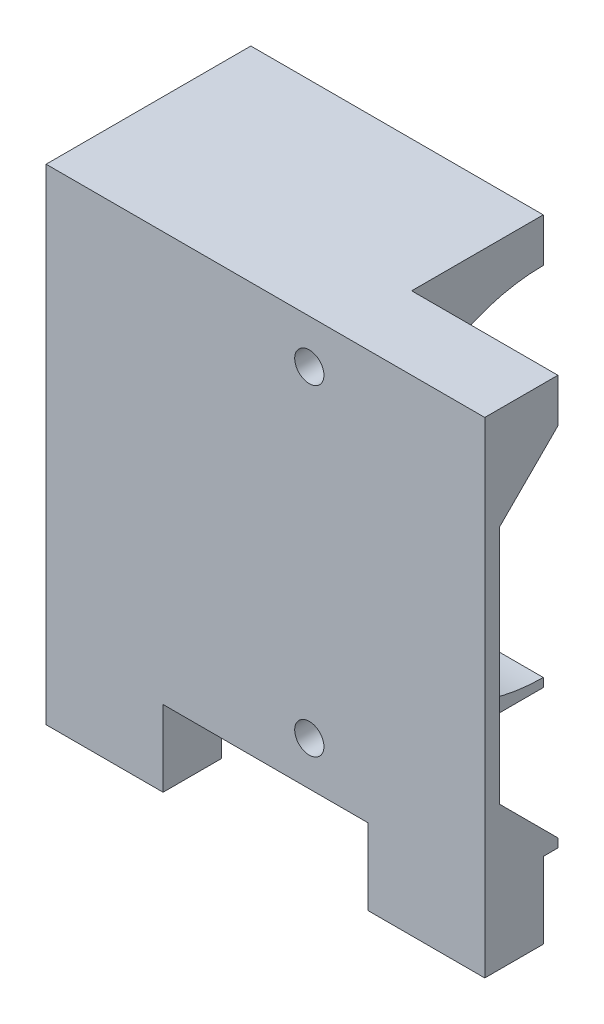
ISO-10303-21;
HEADER;
FILE_DESCRIPTION(('STEP AP214'),'2;1');
FILE_NAME('part.step','',(''),(''),'','','');
FILE_SCHEMA(('AUTOMOTIVE_DESIGN { 1 0 10303 214 1 1 1 1 }'));
ENDSEC;
DATA;
#1=APPLICATION_CONTEXT('core data for automotive mechanical design processes');
#2=APPLICATION_PROTOCOL_DEFINITION('international standard','automotive_design',2000,#1);
#3=PRODUCT_CONTEXT('',#1,'mechanical');
#4=PRODUCT('Part','Part','',(#3));
#5=PRODUCT_RELATED_PRODUCT_CATEGORY('part','',(#4));
#6=PRODUCT_DEFINITION_FORMATION('','',#4);
#7=PRODUCT_DEFINITION_CONTEXT('part definition',#1,'design');
#8=PRODUCT_DEFINITION('design','',#6,#7);
#9=PRODUCT_DEFINITION_SHAPE('','',#8);
#10=(LENGTH_UNIT() NAMED_UNIT(*) SI_UNIT(.MILLI.,.METRE.));
#11=(NAMED_UNIT(*) PLANE_ANGLE_UNIT() SI_UNIT($,.RADIAN.));
#12=(NAMED_UNIT(*) SI_UNIT($,.STERADIAN.) SOLID_ANGLE_UNIT());
#13=UNCERTAINTY_MEASURE_WITH_UNIT(LENGTH_MEASURE(1.E-05),#10,'distance_accuracy_value','');
#14=(GEOMETRIC_REPRESENTATION_CONTEXT(3) GLOBAL_UNCERTAINTY_ASSIGNED_CONTEXT((#13)) GLOBAL_UNIT_ASSIGNED_CONTEXT((#10,
#11,#12)) REPRESENTATION_CONTEXT('',''));
#15=CARTESIAN_POINT('',(0.,0.,0.));
#16=DIRECTION('',(0.,0.,1.));
#17=DIRECTION('',(1.,0.,0.));
#18=AXIS2_PLACEMENT_3D('',#15,#16,#17);
#19=CARTESIAN_POINT('',(0.,-12.8,0.));
#20=DIRECTION('',(0.,-1.,0.));
#21=DIRECTION('',(0.,0.,-1.));
#22=AXIS2_PLACEMENT_3D('',#19,#20,#21);
#23=PLANE('',#22);
#24=DIRECTION('',(0.,0.,-1.));
#25=VECTOR('',#24,1.);
#26=CARTESIAN_POINT('',(20.,-12.8,0.));
#27=LINE('',#26,#25);
#28=CARTESIAN_POINT('',(20.,-12.8,9.00000000000004));
#29=VERTEX_POINT('',#28);
#30=CARTESIAN_POINT('',(20.,-12.8,0.));
#31=VERTEX_POINT('',#30);
#32=EDGE_CURVE('E494',#29,#31,#27,.T.);
#33=ORIENTED_EDGE('',*,*,#32,.F.);
#34=DIRECTION('',(-1.,0.,0.));
#35=VECTOR('',#34,1.);
#36=CARTESIAN_POINT('',(0.,-12.8,9.00000000000004));
#37=LINE('',#36,#35);
#38=CARTESIAN_POINT('',(30.,-12.8,9.00000000000004));
#39=VERTEX_POINT('',#38);
#40=EDGE_CURVE('E498',#39,#29,#37,.T.);
#41=ORIENTED_EDGE('',*,*,#40,.F.);
#42=DIRECTION('',(0.,0.,1.));
#43=VECTOR('',#42,1.);
#44=CARTESIAN_POINT('',(30.,-12.8,13.));
#45=LINE('',#44,#43);
#46=CARTESIAN_POINT('',(30.,-12.8,10.));
#47=VERTEX_POINT('',#46);
#48=EDGE_CURVE('E196',#39,#47,#45,.T.);
#49=ORIENTED_EDGE('',*,*,#48,.T.);
#50=DIRECTION('',(1.,0.,0.));
#51=VECTOR('',#50,1.);
#52=CARTESIAN_POINT('',(22.,-12.8,10.));
#53=LINE('',#52,#51);
#54=CARTESIAN_POINT('',(22.,-12.8,10.));
#55=VERTEX_POINT('',#54);
#56=EDGE_CURVE('E286',#55,#47,#53,.T.);
#57=ORIENTED_EDGE('',*,*,#56,.F.);
#58=DIRECTION('',(0.,0.,-1.));
#59=VECTOR('',#58,1.);
#60=CARTESIAN_POINT('',(22.,-12.8,14.));
#61=LINE('',#60,#59);
#62=CARTESIAN_POINT('',(22.,-12.8,14.));
#63=VERTEX_POINT('',#62);
#64=EDGE_CURVE('E292',#63,#55,#61,.T.);
#65=ORIENTED_EDGE('',*,*,#64,.F.);
#66=DIRECTION('',(-1.,0.,0.));
#67=VECTOR('',#66,1.);
#68=CARTESIAN_POINT('',(30.,-12.8,14.));
#69=LINE('',#68,#67);
#70=CARTESIAN_POINT('',(8.,-12.8,14.));
#71=VERTEX_POINT('',#70);
#72=EDGE_CURVE('E204',#63,#71,#69,.T.);
#73=ORIENTED_EDGE('',*,*,#72,.T.);
#74=DIRECTION('',(0.,0.,1.));
#75=VECTOR('',#74,1.);
#76=CARTESIAN_POINT('',(8.,-12.8,14.));
#77=LINE('',#76,#75);
#78=CARTESIAN_POINT('',(8.,-12.8,10.));
#79=VERTEX_POINT('',#78);
#80=EDGE_CURVE('E322',#79,#71,#77,.T.);
#81=ORIENTED_EDGE('',*,*,#80,.F.);
#82=DIRECTION('',(1.,0.,0.));
#83=VECTOR('',#82,1.);
#84=CARTESIAN_POINT('',(0.,-12.8,10.));
#85=LINE('',#84,#83);
#86=CARTESIAN_POINT('',(0.,-12.8,10.));
#87=VERTEX_POINT('',#86);
#88=EDGE_CURVE('E316',#87,#79,#85,.T.);
#89=ORIENTED_EDGE('',*,*,#88,.F.);
#90=DIRECTION('',(0.,0.,-1.));
#91=VECTOR('',#90,1.);
#92=CARTESIAN_POINT('',(0.,-12.8,14.));
#93=LINE('',#92,#91);
#94=CARTESIAN_POINT('',(0.,-12.8,0.));
#95=VERTEX_POINT('',#94);
#96=EDGE_CURVE('E208',#87,#95,#93,.T.);
#97=ORIENTED_EDGE('',*,*,#96,.T.);
#98=DIRECTION('',(1.,0.,0.));
#99=VECTOR('',#98,1.);
#100=CARTESIAN_POINT('',(0.,-12.8,0.));
#101=LINE('',#100,#99);
#102=EDGE_CURVE('E216',#95,#31,#101,.T.);
#103=ORIENTED_EDGE('',*,*,#102,.T.);
#104=EDGE_LOOP('',(#33,#41,#49,#57,#65,#73,#81,#89,#97,#103));
#105=FACE_BOUND('',#104,.T.);
#106=ADVANCED_FACE('F41',(#105),#23,.T.);
#107=CARTESIAN_POINT('',(20.,0.,0.));
#108=DIRECTION('',(1.,0.,0.));
#109=DIRECTION('',(0.,0.,-1.));
#110=AXIS2_PLACEMENT_3D('',#107,#108,#109);
#111=PLANE('',#110);
#112=CARTESIAN_POINT('',(20.,0.,0.));
#113=DIRECTION('',(-1.,0.,0.));
#114=DIRECTION('',(0.,0.,-1.));
#115=AXIS2_PLACEMENT_3D('',#112,#113,#114);
#116=CIRCLE('',#115,12.2);
#117=CARTESIAN_POINT('',(20.,-12.2,0.));
#118=VERTEX_POINT('',#117);
#119=CARTESIAN_POINT('',(20.,12.2,0.));
#120=VERTEX_POINT('',#119);
#121=EDGE_CURVE('E236',#118,#120,#116,.T.);
#122=ORIENTED_EDGE('',*,*,#121,.T.);
#123=DIRECTION('',(0.,-1.,0.));
#124=VECTOR('',#123,1.);
#125=CARTESIAN_POINT('',(20.,15.2,0.));
#126=LINE('',#125,#124);
#127=CARTESIAN_POINT('',(20.,15.2,0.));
#128=VERTEX_POINT('',#127);
#129=EDGE_CURVE('E267',#128,#120,#126,.T.);
#130=ORIENTED_EDGE('',*,*,#129,.F.);
#131=DIRECTION('',(0.,0.,-1.));
#132=VECTOR('',#131,1.);
#133=CARTESIAN_POINT('',(20.,15.2,8.99999999999999));
#134=LINE('',#133,#132);
#135=CARTESIAN_POINT('',(20.,15.2,8.99999999999999));
#136=VERTEX_POINT('',#135);
#137=EDGE_CURVE('E275',#136,#128,#134,.T.);
#138=ORIENTED_EDGE('',*,*,#137,.F.);
#139=DIRECTION('',(0.,-1.,0.));
#140=VECTOR('',#139,1.);
#141=CARTESIAN_POINT('',(20.,15.2,8.99999999999999));
#142=LINE('',#141,#140);
#143=CARTESIAN_POINT('',(20.,12.2,8.99999999999999));
#144=VERTEX_POINT('',#143);
#145=EDGE_CURVE('E273',#136,#144,#142,.T.);
#146=ORIENTED_EDGE('',*,*,#145,.T.);
#147=DIRECTION('',(0.,0.707106781186546,-0.707106781186549));
#148=VECTOR('',#147,1.);
#149=CARTESIAN_POINT('',(20.,8.2,13.));
#150=LINE('',#149,#148);
#151=CARTESIAN_POINT('',(20.,8.2,13.));
#152=VERTEX_POINT('',#151);
#153=EDGE_CURVE('E351',#152,#144,#150,.T.);
#154=ORIENTED_EDGE('',*,*,#153,.F.);
#155=DIRECTION('',(0.,1.,0.));
#156=VECTOR('',#155,1.);
#157=CARTESIAN_POINT('',(20.,12.2,13.));
#158=LINE('',#157,#156);
#159=CARTESIAN_POINT('',(20.,-8.2,13.));
#160=VERTEX_POINT('',#159);
#161=EDGE_CURVE('E225',#160,#152,#158,.T.);
#162=ORIENTED_EDGE('',*,*,#161,.F.);
#163=DIRECTION('',(0.,0.707106781186551,0.707106781186544));
#164=VECTOR('',#163,1.);
#165=CARTESIAN_POINT('',(20.,-8.2,13.));
#166=LINE('',#165,#164);
#167=CARTESIAN_POINT('',(20.,-12.2,9.00000000000004));
#168=VERTEX_POINT('',#167);
#169=EDGE_CURVE('E185',#168,#160,#166,.T.);
#170=ORIENTED_EDGE('',*,*,#169,.F.);
#171=DIRECTION('',(0.,1.,0.));
#172=VECTOR('',#171,1.);
#173=CARTESIAN_POINT('',(20.,-15.2,9.00000000000004));
#174=LINE('',#173,#172);
#175=EDGE_CURVE('E180',#29,#168,#174,.T.);
#176=ORIENTED_EDGE('',*,*,#175,.F.);
#177=ORIENTED_EDGE('',*,*,#32,.T.);
#178=DIRECTION('',(0.,1.,0.));
#179=VECTOR('',#178,1.);
#180=CARTESIAN_POINT('',(20.,-15.2,0.));
#181=LINE('',#180,#179);
#182=EDGE_CURVE('E198',#31,#118,#181,.T.);
#183=ORIENTED_EDGE('',*,*,#182,.T.);
#184=EDGE_LOOP('',(#122,#130,#138,#146,#154,#162,#170,#176,#177,#183));
#185=FACE_BOUND('',#184,.T.);
#186=ADVANCED_FACE('F370',(#185),#111,.T.);
#187=CARTESIAN_POINT('',(30.,12.2,13.));
#188=DIRECTION('',(0.,0.,1.));
#189=DIRECTION('',(0.,-1.,0.));
#190=AXIS2_PLACEMENT_3D('',#187,#188,#189);
#191=PLANE('',#190);
#192=DIRECTION('',(-1.,0.,0.));
#193=VECTOR('',#192,1.);
#194=CARTESIAN_POINT('',(43.7898513407506,8.2,13.));
#195=LINE('',#194,#193);
#196=CARTESIAN_POINT('',(30.,8.2,13.));
#197=VERTEX_POINT('',#196);
#198=EDGE_CURVE('E350',#197,#152,#195,.T.);
#199=ORIENTED_EDGE('',*,*,#198,.F.);
#200=DIRECTION('',(0.,1.,0.));
#201=VECTOR('',#200,1.);
#202=CARTESIAN_POINT('',(30.,12.2,13.));
#203=LINE('',#202,#201);
#204=CARTESIAN_POINT('',(30.,-8.2,13.));
#205=VERTEX_POINT('',#204);
#206=EDGE_CURVE('E229',#205,#197,#203,.T.);
#207=ORIENTED_EDGE('',*,*,#206,.F.);
#208=DIRECTION('',(-1.,0.,0.));
#209=VECTOR('',#208,1.);
#210=CARTESIAN_POINT('',(43.7898513407506,-8.2,13.));
#211=LINE('',#210,#209);
#212=EDGE_CURVE('E202',#205,#160,#211,.T.);
#213=ORIENTED_EDGE('',*,*,#212,.T.);
#214=ORIENTED_EDGE('',*,*,#161,.T.);
#215=EDGE_LOOP('',(#199,#207,#213,#214));
#216=FACE_BOUND('',#215,.T.);
#217=ADVANCED_FACE('F454',(#216),#191,.F.);
#218=CARTESIAN_POINT('',(20.,0.,0.));
#219=DIRECTION('',(-1.,0.,0.));
#220=DIRECTION('',(0.,0.,1.));
#221=AXIS2_PLACEMENT_3D('',#218,#219,#220);
#222=CYLINDRICAL_SURFACE('',#221,12.2);
#223=CARTESIAN_POINT('',(19.,-9.8,7.26636084983398));
#224=CARTESIAN_POINT('',(18.9999951019403,-9.75839639912615,7.322473771272));
#225=CARTESIAN_POINT('',(18.9974091873031,-9.71632508140205,7.37820370502906));
#226=CARTESIAN_POINT('',(18.9866248535736,-9.63146681741656,7.48863686820499));
#227=CARTESIAN_POINT('',(18.978424516875,-9.58867963152296,7.54333974027009));
#228=CARTESIAN_POINT('',(18.9558876449707,-9.50295388367639,7.65105165130367));
#229=CARTESIAN_POINT('',(18.9415722271065,-9.46001634244181,7.70406585094563));
#230=CARTESIAN_POINT('',(18.9061155136149,-9.37444462188545,7.80796432568367));
#231=CARTESIAN_POINT('',(18.8849815169611,-9.33181016777696,7.85885081289553));
#232=CARTESIAN_POINT('',(18.835477023412,-9.24837459549311,7.95686085357734));
#233=CARTESIAN_POINT('',(18.8072409119355,-9.20755439734766,8.00403498962398));
#234=CARTESIAN_POINT('',(18.7424623227532,-9.12815928575637,8.0944619511984));
#235=CARTESIAN_POINT('',(18.7059271989872,-9.08958242222658,8.13771820126946));
#236=CARTESIAN_POINT('',(18.6311127350271,-9.02299644257417,8.21142791870496));
#237=CARTESIAN_POINT('',(18.5943202779621,-8.99433262841308,8.24278637556552));
#238=CARTESIAN_POINT('',(18.514369097831,-8.9410929838898,8.30050556158183));
#239=CARTESIAN_POINT('',(18.4712197791857,-8.91651122684542,8.32687354425474));
#240=CARTESIAN_POINT('',(18.3890831901773,-8.87794029242221,8.36796220187855));
#241=CARTESIAN_POINT('',(18.3512796299063,-8.86281068229324,8.38396909329451));
#242=CARTESIAN_POINT('',(18.2725481648678,-8.83696857060242,8.41120326062106));
#243=CARTESIAN_POINT('',(18.231622298562,-8.8262532158614,8.42243362402061));
#244=CARTESIAN_POINT('',(18.1473568023745,-8.80998129660635,8.43945334850474));
#245=CARTESIAN_POINT('',(18.1040035587846,-8.80445774521948,8.44520789331585));
#246=CARTESIAN_POINT('',(18.0165698370098,-8.79918004857003,8.45070689457084));
#247=CARTESIAN_POINT('',(17.972489639076,-8.79942372961931,8.45045361538253));
#248=CARTESIAN_POINT('',(17.889623537487,-8.80533044342407,8.44429798208322));
#249=CARTESIAN_POINT('',(17.850752530175,-8.81044369955205,8.43896870185735));
#250=CARTESIAN_POINT('',(17.7747343858212,-8.82493421207749,8.42381416212689));
#251=CARTESIAN_POINT('',(17.7375874271231,-8.83431190853011,8.41398843862568));
#252=CARTESIAN_POINT('',(17.6644320328574,-8.85717522703758,8.38991834195471));
#253=CARTESIAN_POINT('',(17.6285185180254,-8.87080169868652,8.37552209790913));
#254=CARTESIAN_POINT('',(17.5598539576093,-8.90128671577651,8.34311640498895));
#255=CARTESIAN_POINT('',(17.5271045667051,-8.91814693869897,8.32510508059532));
#256=CARTESIAN_POINT('',(17.4483929463389,-8.9640748993302,8.27568806153631));
#257=CARTESIAN_POINT('',(17.4046955087455,-8.99485851016865,8.24226092153628));
#258=CARTESIAN_POINT('',(17.3250973504188,-9.06028749269575,8.17028619653206));
#259=CARTESIAN_POINT('',(17.2892160811212,-9.09494218130143,8.13172621314567));
#260=CARTESIAN_POINT('',(17.2098551604049,-9.18304894360215,8.03229654497991));
#261=CARTESIAN_POINT('',(17.1704797736588,-9.23781125417601,7.96932734081708));
#262=CARTESIAN_POINT('',(17.1050473218695,-9.34917678779152,7.83838836032833));
#263=CARTESIAN_POINT('',(17.0790121387382,-9.40578287448098,7.77041057597106));
#264=CARTESIAN_POINT('',(17.0435107369384,-9.50478821300961,7.64875939799422));
#265=CARTESIAN_POINT('',(17.0315244778411,-9.5471811303799,7.59578665189993));
#266=CARTESIAN_POINT('',(17.0133458239082,-9.63154952288017,7.48851944888924));
#267=CARTESIAN_POINT('',(17.0071563450387,-9.67352477742028,7.43422434085644));
#268=CARTESIAN_POINT('',(16.9965020262136,-9.79844814349622,7.26975277269183));
#269=CARTESIAN_POINT('',(16.9999867427483,-9.88028572009521,7.15812270862606));
#270=CARTESIAN_POINT('',(17.0194962000273,-10.0008779948107,6.98767449340814));
#271=CARTESIAN_POINT('',(17.0287031116996,-10.0414666094349,6.92921161784075));
#272=CARTESIAN_POINT('',(17.0520661141829,-10.1211640289023,6.81227031665492));
#273=CARTESIAN_POINT('',(17.0662202322588,-10.1602734167195,6.75379190650498));
#274=CARTESIAN_POINT('',(17.0994430196776,-10.236726398515,6.63733943297201));
#275=CARTESIAN_POINT('',(17.1184972082006,-10.2740748181167,6.57936439519263));
#276=CARTESIAN_POINT('',(17.1617433034792,-10.346918474786,6.46420243377413));
#277=CARTESIAN_POINT('',(17.1859322889166,-10.3824147513403,6.40701508161776));
#278=CARTESIAN_POINT('',(17.238352637079,-10.4493028477658,6.2972974384712));
#279=CARTESIAN_POINT('',(17.2662678664056,-10.4808133159989,6.24468950396364));
#280=CARTESIAN_POINT('',(17.3278580372318,-10.5416908281703,6.14136392281031));
#281=CARTESIAN_POINT('',(17.3615468637097,-10.5710524555834,6.09065120071016));
#282=CARTESIAN_POINT('',(17.4361983450749,-10.627254162087,5.9920553251412));
#283=CARTESIAN_POINT('',(17.4772471456419,-10.6540578874406,5.94421577562127));
#284=CARTESIAN_POINT('',(17.5680201653627,-10.7033508903423,5.85498296106352));
#285=CARTESIAN_POINT('',(17.6176918525665,-10.7258646543301,5.81355338085668));
#286=CARTESIAN_POINT('',(17.6973949505115,-10.7534752467967,5.76221448899234));
#287=CARTESIAN_POINT('',(17.7233087667438,-10.7613631071318,5.74745914075393));
#288=CARTESIAN_POINT('',(17.7772804644183,-10.7752806092437,5.72132359490914));
#289=CARTESIAN_POINT('',(17.8053370499211,-10.7813113632576,5.70994137725987));
#290=CARTESIAN_POINT('',(17.8636102609801,-10.7910993871494,5.69142233521061));
#291=CARTESIAN_POINT('',(17.8938481261187,-10.7948295395822,5.68433616476535));
#292=CARTESIAN_POINT('',(17.9553007792492,-10.7994733355157,5.67550905125707));
#293=CARTESIAN_POINT('',(17.9865142154852,-10.8003907156164,5.67376101681187));
#294=CARTESIAN_POINT('',(18.0450217224969,-10.7993638111779,5.67571495985376));
#295=CARTESIAN_POINT('',(18.072344914943,-10.7977434650693,5.67880001217109));
#296=CARTESIAN_POINT('',(18.1260245457789,-10.7923946104673,5.68895868897423));
#297=CARTESIAN_POINT('',(18.1523801495044,-10.7886643253757,5.69603567471014));
#298=CARTESIAN_POINT('',(18.2120083553291,-10.7778794286953,5.71642241415072));
#299=CARTESIAN_POINT('',(18.2447117799562,-10.7701355449256,5.73101552975052));
#300=CARTESIAN_POINT('',(18.30709035435,-10.75223653844,5.7645270809336));
#301=CARTESIAN_POINT('',(18.3367583645939,-10.7420759097266,5.7834553895506));
#302=CARTESIAN_POINT('',(18.411755341776,-10.7126832923737,5.83779786678237));
#303=CARTESIAN_POINT('',(18.4545262294816,-10.6918848130714,5.8758580345482));
#304=CARTESIAN_POINT('',(18.5334023307482,-10.6470795825837,5.9566648855123));
#305=CARTESIAN_POINT('',(18.569487679907,-10.6230636245339,5.99942495202629));
#306=CARTESIAN_POINT('',(18.6345085574204,-10.5739328525204,6.08558006234385));
#307=CARTESIAN_POINT('',(18.6637067655203,-10.5489285743825,6.12884268098506));
#308=CARTESIAN_POINT('',(18.7178447414388,-10.4972095380298,6.21700968186416));
#309=CARTESIAN_POINT('',(18.7427808215311,-10.4704933257966,6.26191544543043));
#310=CARTESIAN_POINT('',(18.7888765660626,-10.4155959580269,6.35280906332651));
#311=CARTESIAN_POINT('',(18.8100328135093,-10.3874135064156,6.39879785464559));
#312=CARTESIAN_POINT('',(18.8488537445388,-10.3297683893212,6.49144552167124));
#313=CARTESIAN_POINT('',(18.8665176520294,-10.3003054410477,6.5381045438556));
#314=CARTESIAN_POINT('',(18.9018428876558,-10.2340128481421,6.64149721463276));
#315=CARTESIAN_POINT('',(18.91874988185,-10.1969187239288,6.69832090630451));
#316=CARTESIAN_POINT('',(18.9478690255452,-10.1212273991921,6.81215421957728));
#317=CARTESIAN_POINT('',(18.9600801372408,-10.0826298684843,6.86916387947362));
#318=CARTESIAN_POINT('',(18.9896732920444,-9.96471877155049,7.04013212251928));
#319=CARTESIAN_POINT('',(19.0000098066722,-9.88329683593586,7.15401411270715));
#320=CARTESIAN_POINT('',(19.,-9.8,7.26636084983398));
#321=B_SPLINE_CURVE_WITH_KNOTS('',3,(#223,#224,#225,#226,#227,#228,#229,#230,#231,#232,#233,
#234,#235,#236,#237,#238,#239,#240,#241,#242,#243,#244,#245,#246,#247,#248,#249,#250,#251,#252,
#253,#254,#255,#256,#257,#258,#259,#260,#261,#262,#263,#264,#265,#266,#267,#268,#269,#270,#271,
#272,#273,#274,#275,#276,#277,#278,#279,#280,#281,#282,#283,#284,#285,#286,#287,#288,#289,#290,
#291,#292,#293,#294,#295,#296,#297,#298,#299,#300,#301,#302,#303,#304,#305,#306,#307,#308,#309,
#310,#311,#312,#313,#314,#315,#316,#317,#318,#319,#320),.UNSPECIFIED.,.T.,.F.,(4,2,2,2,2,2,2,2,
2,2,2,2,2,2,2,2,2,2,2,2,2,2,2,2,2,2,2,2,2,2,2,2,2,2,2,2,2,2,2,2,2,2,2,2,2,2,2,2,4),(0.,
0.209451237013676,0.418974047828406,0.627779085126616,0.836361343768984,1.04126010121244,
1.24597799673009,1.41399554412923,1.58176697498808,1.71250521004581,1.84315880860972,
1.97463768323555,2.10606700384691,2.22422349365931,2.34239217901709,2.46499183499756,
2.58765526137787,2.77571803649254,2.9642436120573,3.23954318790848,3.51529290306696,
3.72171300578965,3.92823688875091,4.34180302501645,4.55696836132573,4.77204799657041,
4.98649918410129,5.20082869026583,5.40271757958828,5.60509898721111,5.81002548345986,
6.01374474639197,6.10603773407127,6.19827533868859,6.29158035896336,6.38476137527449,
6.46698100010749,6.54926995829699,6.65856960896198,6.7681207000401,6.94983976506714,
7.13209039445232,7.30546207178664,7.47898300459161,7.65266001633771,7.82637558052504,
8.0359770349589,8.24562478541473,8.66497851825604),.UNSPECIFIED.);
#322=CARTESIAN_POINT('',(19.,-9.8,7.26636084983398));
#323=VERTEX_POINT('',#322);
#324=EDGE_CURVE('E388',#323,#323,#321,.T.);
#325=ORIENTED_EDGE('',*,*,#324,.T.);
#326=EDGE_LOOP('',(#325));
#327=FACE_BOUND('',#326,.T.);
#328=DIRECTION('',(-1.,0.,0.));
#329=VECTOR('',#328,1.);
#330=CARTESIAN_POINT('',(20.,12.2,0.));
#331=LINE('',#330,#329);
#332=CARTESIAN_POINT('',(17.,12.2,0.));
#333=VERTEX_POINT('',#332);
#334=CARTESIAN_POINT('',(0.,12.2,0.));
#335=VERTEX_POINT('',#334);
#336=EDGE_CURVE('E51',#333,#335,#331,.T.);
#337=ORIENTED_EDGE('',*,*,#336,.F.);
#338=CARTESIAN_POINT('',(17.,12.2,0.));
#339=CARTESIAN_POINT('',(17.000003386518,12.1999999903481,0.0828428717524075));
#340=CARTESIAN_POINT('',(16.9999995583837,12.1991561643882,0.165683397825968));
#341=CARTESIAN_POINT('',(17.0000068487499,12.1957813761313,0.331330076990716));
#342=CARTESIAN_POINT('',(17.0000179672507,12.1932504138007,0.414136230081218));
#343=CARTESIAN_POINT('',(17.000117826203,12.1831255809122,0.66250731613896));
#344=CARTESIAN_POINT('',(17.0002731026956,12.1729997647555,0.827976086824617));
#345=CARTESIAN_POINT('',(17.0013785527574,12.1457355456454,1.16177886881091));
#346=CARTESIAN_POINT('',(17.0023451220015,12.1284562553978,1.33010124923694));
#347=CARTESIAN_POINT('',(17.0061946030503,12.0869198766639,1.66582244591738));
#348=CARTESIAN_POINT('',(17.0090769981131,12.0626646707417,1.83322149894148));
#349=CARTESIAN_POINT('',(17.0183592793546,12.0071954152815,2.16700793224814));
#350=CARTESIAN_POINT('',(17.0247639989648,11.9759718386143,2.33339360401428));
#351=CARTESIAN_POINT('',(17.0433131599214,11.906655800117,2.6646157044976));
#352=CARTESIAN_POINT('',(17.0554628165865,11.86855711646,2.82945058643586));
#353=CARTESIAN_POINT('',(17.0803246718761,11.8067113207415,3.07384673364089));
#354=CARTESIAN_POINT('',(17.0896467183309,11.7854470799205,3.15438602263612));
#355=CARTESIAN_POINT('',(17.1110314547224,11.7413742656985,3.31466934682371));
#356=CARTESIAN_POINT('',(17.1230936799359,11.7185659546255,3.39441351447426));
#357=CARTESIAN_POINT('',(17.1506076251612,11.6715366159059,3.55275150126662));
#358=CARTESIAN_POINT('',(17.1660536145727,11.6473180269548,3.6313470284911));
#359=CARTESIAN_POINT('',(17.2012267935722,11.5975946457157,3.78714573298034));
#360=CARTESIAN_POINT('',(17.2209516316716,11.5720905657699,3.86434964987894));
#361=CARTESIAN_POINT('',(17.2520676160648,11.5360951764337,3.96981942980117));
#362=CARTESIAN_POINT('',(17.2611060923312,11.5260352344678,3.99893126005435));
#363=CARTESIAN_POINT('',(17.2800935077082,11.5057902906436,4.05681283848244));
#364=CARTESIAN_POINT('',(17.2900424941673,11.4956052823055,4.08558256877944));
#365=CARTESIAN_POINT('',(17.3215254408212,11.4647835305145,4.17162510133746));
#366=CARTESIAN_POINT('',(17.344600841918,11.4439926518024,4.22830175849792));
#367=CARTESIAN_POINT('',(17.3876496961936,11.4090983913426,4.32135267295958));
#368=CARTESIAN_POINT('',(17.4062216306203,11.39500176378,4.35837709053974));
#369=CARTESIAN_POINT('',(17.446204634423,11.3669889188216,4.43092209491917));
#370=CARTESIAN_POINT('',(17.4676138562414,11.3530725904393,4.46644364065402));
#371=CARTESIAN_POINT('',(17.5136962428505,11.325802513076,4.53514644741573));
#372=CARTESIAN_POINT('',(17.5383445438854,11.3124454093234,4.56834284660515));
#373=CARTESIAN_POINT('',(17.5916994929355,11.2866724118508,4.63165029183189));
#374=CARTESIAN_POINT('',(17.6203950304969,11.2742540797882,4.66176940775884));
#375=CARTESIAN_POINT('',(17.6714099633539,11.2552899532555,4.70731585532169));
#376=CARTESIAN_POINT('',(17.6922989670164,11.2482409364627,4.72412542883967));
#377=CARTESIAN_POINT('',(17.7362324794196,11.2351412888003,4.7551954180229));
#378=CARTESIAN_POINT('',(17.7592778739749,11.2290910710692,4.76945477903284));
#379=CARTESIAN_POINT('',(17.8077741370935,11.2183321474258,4.79470701893806));
#380=CARTESIAN_POINT('',(17.8332491675034,11.2136393125249,4.80566131298682));
#381=CARTESIAN_POINT('',(17.8859638866078,11.2061691044766,4.82305565969229));
#382=CARTESIAN_POINT('',(17.9132003636146,11.2033883470329,4.829503688581));
#383=CARTESIAN_POINT('',(17.9665576071161,11.200228450023,4.83682727961025));
#384=CARTESIAN_POINT('',(17.9926173517533,11.1996906960215,4.83807089591821));
#385=CARTESIAN_POINT('',(18.0444949408281,11.2006536641591,4.83584106560611));
#386=CARTESIAN_POINT('',(18.0703127709465,11.2021545062078,4.83236734151333));
#387=CARTESIAN_POINT('',(18.1174755878181,11.2066785627858,4.82186498019404));
#388=CARTESIAN_POINT('',(18.138964178354,11.2094771953864,4.81536023940586));
#389=CARTESIAN_POINT('',(18.1807003959933,11.2162344365686,4.79959986457201));
#390=CARTESIAN_POINT('',(18.2009476121923,11.2201934267574,4.79034332552708));
#391=CARTESIAN_POINT('',(18.2523686530597,11.2318165780578,4.76304843499015));
#392=CARTESIAN_POINT('',(18.2823804026556,11.240242817678,4.74315338430474));
#393=CARTESIAN_POINT('',(18.3387345112438,11.2586479553968,4.69929936880997));
#394=CARTESIAN_POINT('',(18.3650657663972,11.2686313675253,4.67532857016512));
#395=CARTESIAN_POINT('',(18.4117960947338,11.2884106025605,4.62735200430135));
#396=CARTESIAN_POINT('',(18.4325285322754,11.2981116076363,4.60362598318759));
#397=CARTESIAN_POINT('',(18.4717348517167,11.3179860036373,4.55454680635841));
#398=CARTESIAN_POINT('',(18.490206819551,11.3281597849689,4.52919229903401));
#399=CARTESIAN_POINT('',(18.5427417843051,11.3591112992593,4.45125872564929));
#400=CARTESIAN_POINT('',(18.5738691597248,11.3802942386657,4.39686978252086));
#401=CARTESIAN_POINT('',(18.6407301849273,11.4307051256678,4.2644699789416));
#402=CARTESIAN_POINT('',(18.6738574810291,11.4599892940783,4.18520955502616));
#403=CARTESIAN_POINT('',(18.7322796963708,11.5177666395483,4.02348902524985));
#404=CARTESIAN_POINT('',(18.7575589140076,11.5462581283915,3.94102287170107));
#405=CARTESIAN_POINT('',(18.8024479028512,11.6021912971016,3.77320360421243));
#406=CARTESIAN_POINT('',(18.8219940978167,11.6296184769589,3.68782903792358));
#407=CARTESIAN_POINT('',(18.8564423806049,11.6827919874685,3.51574773541551));
#408=CARTESIAN_POINT('',(18.8713487549493,11.7085398520733,3.42904230691051));
#409=CARTESIAN_POINT('',(18.9053500257982,11.7729679045171,3.20282599880127));
#410=CARTESIAN_POINT('',(18.9216827734533,11.8102573579491,3.06250668551326));
#411=CARTESIAN_POINT('',(18.9481178584982,11.8799218250052,2.78004500959674));
#412=CARTESIAN_POINT('',(18.958216891806,11.9122942255816,2.63790172087078));
#413=CARTESIAN_POINT('',(18.9741622095864,11.9720401744988,2.35194501147096));
#414=CARTESIAN_POINT('',(18.9799970336142,11.9994001047617,2.20812813776849));
#415=CARTESIAN_POINT('',(18.9888436528075,12.0489376262116,1.91951675704195));
#416=CARTESIAN_POINT('',(18.9918552469798,12.0711148483436,1.77472218115167));
#417=CARTESIAN_POINT('',(18.9960118992643,12.1089167401278,1.49424873747466));
#418=CARTESIAN_POINT('',(18.9972696519881,12.1248836967766,1.35861733045832));
#419=CARTESIAN_POINT('',(18.998953124649,12.1522561146163,1.08688519011824));
#420=CARTESIAN_POINT('',(18.9993788123722,12.1636613991858,0.950784438827904));
#421=CARTESIAN_POINT('',(18.999878766565,12.1818492684304,0.678973468161607));
#422=CARTESIAN_POINT('',(18.9999548191347,12.1886551961519,0.543264811234845));
#423=CARTESIAN_POINT('',(18.9999988461775,12.1977308758061,0.271704113798151));
#424=CARTESIAN_POINT('',(18.9999668272158,12.2000009032746,0.135852082499197));
#425=CARTESIAN_POINT('',(19.000000000003,12.2,4.60025870261651E-13));
#426=B_SPLINE_CURVE_WITH_KNOTS('',3,(#338,#339,#340,#341,#342,#343,#344,#345,#346,#347,#348,
#349,#350,#351,#352,#353,#354,#355,#356,#357,#358,#359,#360,#361,#362,#363,#364,#365,#366,#367,
#368,#369,#370,#371,#372,#373,#374,#375,#376,#377,#378,#379,#380,#381,#382,#383,#384,#385,#386,
#387,#388,#389,#390,#391,#392,#393,#394,#395,#396,#397,#398,#399,#400,#401,#402,#403,#404,#405,
#406,#407,#408,#409,#410,#411,#412,#413,#414,#415,#416,#417,#418,#419,#420,#421,#422,#423,#424,
#425),.UNSPECIFIED.,.F.,.F.,(4,2,2,2,2,2,2,2,2,2,2,2,2,2,2,2,2,2,2,2,2,2,2,2,2,2,2,2,2,2,2,2,2,
2,2,2,2,2,2,2,2,2,2,4),(0.,0.248519627516359,0.497039259991051,0.994224782007207,
1.50170698795773,2.00905236990172,2.51709568865282,3.02560110291694,3.27701022863209,
3.52837674816511,3.77932081038557,4.03012731133876,4.12641319770917,4.22270409399597,
4.41636651928504,4.54754140983672,4.67863129906563,4.80876804192838,4.93855424674906,
5.02155513913749,5.10459027805482,5.18856030810431,5.27238132950638,5.35016248738675,
5.4279482205326,5.49556858827132,5.56321121934642,5.6735137384795,5.78414216503477,
5.88289992174005,5.98174073183541,6.17967491559305,6.45137230422356,6.72360982432508,
6.99876111642114,7.27365744889731,7.71165145308781,8.14987741020284,8.58927685059567,
9.02870757062491,9.43834872003509,9.84800572863715,10.2555676748063,10.6631048626439),.UNSPECIFIED.);
#427=CARTESIAN_POINT('',(19.,12.2,0.));
#428=VERTEX_POINT('',#427);
#429=EDGE_CURVE('E57',#333,#428,#426,.T.);
#430=ORIENTED_EDGE('',*,*,#429,.T.);
#431=EDGE_CURVE('E11',#120,#428,#331,.T.);
#432=ORIENTED_EDGE('',*,*,#431,.F.);
#433=ORIENTED_EDGE('',*,*,#121,.F.);
#434=DIRECTION('',(-1.,0.,0.));
#435=VECTOR('',#434,1.);
#436=CARTESIAN_POINT('',(20.,-12.2,0.));
#437=LINE('',#436,#435);
#438=CARTESIAN_POINT('',(0.,-12.2,0.));
#439=VERTEX_POINT('',#438);
#440=EDGE_CURVE('E239',#118,#439,#437,.T.);
#441=ORIENTED_EDGE('',*,*,#440,.T.);
#442=CARTESIAN_POINT('',(0.,0.,0.));
#443=DIRECTION('',(-1.,0.,0.));
#444=DIRECTION('',(0.,0.,-1.));
#445=AXIS2_PLACEMENT_3D('',#442,#443,#444);
#446=CIRCLE('',#445,12.2);
#447=EDGE_CURVE('E232',#439,#335,#446,.T.);
#448=ORIENTED_EDGE('',*,*,#447,.T.);
#449=EDGE_LOOP('',(#337,#430,#432,#433,#441,#448));
#450=FACE_BOUND('',#449,.T.);
#451=ADVANCED_FACE('F43',(#327,#450),#222,.F.);
#452=CARTESIAN_POINT('',(20.,12.2,14.));
#453=DIRECTION('',(0.,0.,-1.));
#454=DIRECTION('',(0.,1.,0.));
#455=AXIS2_PLACEMENT_3D('',#452,#453,#454);
#456=PLANE('',#455);
#457=CARTESIAN_POINT('',(18.,12.2,14.));
#458=DIRECTION('',(0.,0.,1.));
#459=DIRECTION('',(1.,0.,0.));
#460=AXIS2_PLACEMENT_3D('',#457,#458,#459);
#461=CIRCLE('',#460,1.);
#462=CARTESIAN_POINT('',(19.,12.2,14.));
#463=VERTEX_POINT('',#462);
#464=EDGE_CURVE('E471',#463,#463,#461,.T.);
#465=ORIENTED_EDGE('',*,*,#464,.F.);
#466=EDGE_LOOP('',(#465));
#467=FACE_BOUND('',#466,.T.);
#468=CARTESIAN_POINT('',(18.,-9.8,14.));
#469=DIRECTION('',(0.,0.,1.));
#470=DIRECTION('',(1.,0.,0.));
#471=AXIS2_PLACEMENT_3D('',#468,#469,#470);
#472=CIRCLE('',#471,1.);
#473=CARTESIAN_POINT('',(19.,-9.8,14.));
#474=VERTEX_POINT('',#473);
#475=EDGE_CURVE('E475',#474,#474,#472,.T.);
#476=ORIENTED_EDGE('',*,*,#475,.F.);
#477=EDGE_LOOP('',(#476));
#478=FACE_BOUND('',#477,.T.);
#479=DIRECTION('',(0.,-1.,0.));
#480=VECTOR('',#479,1.);
#481=CARTESIAN_POINT('',(0.,12.2,14.));
#482=LINE('',#481,#480);
#483=CARTESIAN_POINT('',(0.,15.2,14.));
#484=VERTEX_POINT('',#483);
#485=CARTESIAN_POINT('',(0.,-18.,14.));
#486=VERTEX_POINT('',#485);
#487=EDGE_CURVE('E240',#484,#486,#482,.T.);
#488=ORIENTED_EDGE('',*,*,#487,.T.);
#489=DIRECTION('',(-1.,0.,0.));
#490=VECTOR('',#489,1.);
#491=CARTESIAN_POINT('',(0.,-18.,14.));
#492=LINE('',#491,#490);
#493=CARTESIAN_POINT('',(8.,-18.,14.));
#494=VERTEX_POINT('',#493);
#495=EDGE_CURVE('E328',#494,#486,#492,.T.);
#496=ORIENTED_EDGE('',*,*,#495,.F.);
#497=DIRECTION('',(0.,1.,0.));
#498=VECTOR('',#497,1.);
#499=CARTESIAN_POINT('',(8.,-18.,14.));
#500=LINE('',#499,#498);
#501=EDGE_CURVE('E332',#494,#71,#500,.T.);
#502=ORIENTED_EDGE('',*,*,#501,.T.);
#503=ORIENTED_EDGE('',*,*,#72,.F.);
#504=DIRECTION('',(0.,1.,0.));
#505=VECTOR('',#504,1.);
#506=CARTESIAN_POINT('',(22.,-18.,14.));
#507=LINE('',#506,#505);
#508=CARTESIAN_POINT('',(22.,-18.,14.));
#509=VERTEX_POINT('',#508);
#510=EDGE_CURVE('E65',#509,#63,#507,.T.);
#511=ORIENTED_EDGE('',*,*,#510,.F.);
#512=DIRECTION('',(-1.,0.,0.));
#513=VECTOR('',#512,1.);
#514=CARTESIAN_POINT('',(22.,-18.,14.));
#515=LINE('',#514,#513);
#516=CARTESIAN_POINT('',(30.,-18.,14.));
#517=VERTEX_POINT('',#516);
#518=EDGE_CURVE('E296',#517,#509,#515,.T.);
#519=ORIENTED_EDGE('',*,*,#518,.F.);
#520=DIRECTION('',(0.,-1.,0.));
#521=VECTOR('',#520,1.);
#522=CARTESIAN_POINT('',(30.,12.2,14.));
#523=LINE('',#522,#521);
#524=CARTESIAN_POINT('',(30.,15.2,14.));
#525=VERTEX_POINT('',#524);
#526=EDGE_CURVE('E226',#525,#517,#523,.T.);
#527=ORIENTED_EDGE('',*,*,#526,.F.);
#528=DIRECTION('',(1.,0.,0.));
#529=VECTOR('',#528,1.);
#530=CARTESIAN_POINT('',(0.,15.2,14.));
#531=LINE('',#530,#529);
#532=EDGE_CURVE('E382',#484,#525,#531,.T.);
#533=ORIENTED_EDGE('',*,*,#532,.F.);
#534=EDGE_LOOP('',(#488,#496,#502,#503,#511,#519,#527,#533));
#535=FACE_BOUND('',#534,.T.);
#536=ADVANCED_FACE('F461',(#467,#478,#535),#456,.F.);
#537=CARTESIAN_POINT('',(0.,0.,0.));
#538=DIRECTION('',(1.,0.,0.));
#539=DIRECTION('',(0.,0.,-1.));
#540=AXIS2_PLACEMENT_3D('',#537,#538,#539);
#541=PLANE('',#540);
#542=ORIENTED_EDGE('',*,*,#447,.F.);
#543=DIRECTION('',(0.,1.,0.));
#544=VECTOR('',#543,1.);
#545=CARTESIAN_POINT('',(0.,-12.8,0.));
#546=LINE('',#545,#544);
#547=EDGE_CURVE('E222',#95,#439,#546,.T.);
#548=ORIENTED_EDGE('',*,*,#547,.F.);
#549=ORIENTED_EDGE('',*,*,#96,.F.);
#550=DIRECTION('',(0.,1.,0.));
#551=VECTOR('',#550,1.);
#552=CARTESIAN_POINT('',(0.,-18.,9.99999999999999));
#553=LINE('',#552,#551);
#554=CARTESIAN_POINT('',(0.,-18.,9.99999999999999));
#555=VERTEX_POINT('',#554);
#556=EDGE_CURVE('E346',#555,#87,#553,.T.);
#557=ORIENTED_EDGE('',*,*,#556,.F.);
#558=DIRECTION('',(0.,0.,-1.));
#559=VECTOR('',#558,1.);
#560=CARTESIAN_POINT('',(0.,-18.,14.));
#561=LINE('',#560,#559);
#562=EDGE_CURVE('E317',#486,#555,#561,.T.);
#563=ORIENTED_EDGE('',*,*,#562,.F.);
#564=ORIENTED_EDGE('',*,*,#487,.F.);
#565=DIRECTION('',(0.,0.,1.));
#566=VECTOR('',#565,1.);
#567=CARTESIAN_POINT('',(0.,15.2,0.));
#568=LINE('',#567,#566);
#569=CARTESIAN_POINT('',(0.,15.2,0.));
#570=VERTEX_POINT('',#569);
#571=EDGE_CURVE('E265',#570,#484,#568,.T.);
#572=ORIENTED_EDGE('',*,*,#571,.F.);
#573=DIRECTION('',(0.,-1.,0.));
#574=VECTOR('',#573,1.);
#575=CARTESIAN_POINT('',(0.,15.2,0.));
#576=LINE('',#575,#574);
#577=EDGE_CURVE('E258',#570,#335,#576,.T.);
#578=ORIENTED_EDGE('',*,*,#577,.T.);
#579=EDGE_LOOP('',(#542,#548,#549,#557,#563,#564,#572,#578));
#580=FACE_BOUND('',#579,.T.);
#581=ADVANCED_FACE('F263',(#580),#541,.F.);
#582=CARTESIAN_POINT('',(30.,0.,0.));
#583=DIRECTION('',(1.,0.,0.));
#584=DIRECTION('',(0.,0.,-1.));
#585=AXIS2_PLACEMENT_3D('',#582,#583,#584);
#586=PLANE('',#585);
#587=DIRECTION('',(0.,1.,0.));
#588=VECTOR('',#587,1.);
#589=CARTESIAN_POINT('',(30.,-15.2,9.00000000000004));
#590=LINE('',#589,#588);
#591=CARTESIAN_POINT('',(30.,-12.2,9.00000000000004));
#592=VERTEX_POINT('',#591);
#593=EDGE_CURVE('E177',#39,#592,#590,.T.);
#594=ORIENTED_EDGE('',*,*,#593,.T.);
#595=DIRECTION('',(0.,0.707106781186551,0.707106781186544));
#596=VECTOR('',#595,1.);
#597=CARTESIAN_POINT('',(30.,-8.2,13.));
#598=LINE('',#597,#596);
#599=EDGE_CURVE('E193',#592,#205,#598,.T.);
#600=ORIENTED_EDGE('',*,*,#599,.T.);
#601=ORIENTED_EDGE('',*,*,#206,.T.);
#602=DIRECTION('',(0.,0.707106781186546,-0.707106781186549));
#603=VECTOR('',#602,1.);
#604=CARTESIAN_POINT('',(30.,8.2,13.));
#605=LINE('',#604,#603);
#606=CARTESIAN_POINT('',(30.,12.2,8.99999999999999));
#607=VERTEX_POINT('',#606);
#608=EDGE_CURVE('E186',#197,#607,#605,.T.);
#609=ORIENTED_EDGE('',*,*,#608,.T.);
#610=DIRECTION('',(0.,-1.,0.));
#611=VECTOR('',#610,1.);
#612=CARTESIAN_POINT('',(30.,15.2,8.99999999999999));
#613=LINE('',#612,#611);
#614=CARTESIAN_POINT('',(30.,15.2,8.99999999999999));
#615=VERTEX_POINT('',#614);
#616=EDGE_CURVE('E282',#615,#607,#613,.T.);
#617=ORIENTED_EDGE('',*,*,#616,.F.);
#618=DIRECTION('',(0.,0.,-1.));
#619=VECTOR('',#618,1.);
#620=CARTESIAN_POINT('',(30.,15.2,8.99999999999999));
#621=LINE('',#620,#619);
#622=EDGE_CURVE('E377',#525,#615,#621,.T.);
#623=ORIENTED_EDGE('',*,*,#622,.F.);
#624=ORIENTED_EDGE('',*,*,#526,.T.);
#625=DIRECTION('',(0.,0.,1.));
#626=VECTOR('',#625,1.);
#627=CARTESIAN_POINT('',(30.,-18.,14.));
#628=LINE('',#627,#626);
#629=CARTESIAN_POINT('',(30.,-18.,9.99999999999999));
#630=VERTEX_POINT('',#629);
#631=EDGE_CURVE('E291',#630,#517,#628,.T.);
#632=ORIENTED_EDGE('',*,*,#631,.F.);
#633=DIRECTION('',(0.,1.,0.));
#634=VECTOR('',#633,1.);
#635=CARTESIAN_POINT('',(30.,-18.,9.99999999999999));
#636=LINE('',#635,#634);
#637=EDGE_CURVE('E313',#630,#47,#636,.T.);
#638=ORIENTED_EDGE('',*,*,#637,.T.);
#639=ORIENTED_EDGE('',*,*,#48,.F.);
#640=EDGE_LOOP('',(#594,#600,#601,#609,#617,#623,#624,#632,#638,#639));
#641=FACE_BOUND('',#640,.T.);
#642=ADVANCED_FACE('F191',(#641),#586,.T.);
#643=CARTESIAN_POINT('',(0.,-12.8,0.));
#644=DIRECTION('',(0.,0.,1.));
#645=DIRECTION('',(0.,-1.,0.));
#646=AXIS2_PLACEMENT_3D('',#643,#644,#645);
#647=PLANE('',#646);
#648=ORIENTED_EDGE('',*,*,#440,.F.);
#649=ORIENTED_EDGE('',*,*,#182,.F.);
#650=ORIENTED_EDGE('',*,*,#102,.F.);
#651=ORIENTED_EDGE('',*,*,#547,.T.);
#652=EDGE_LOOP('',(#648,#649,#650,#651));
#653=FACE_BOUND('',#652,.T.);
#654=ADVANCED_FACE('F445',(#653),#647,.F.);
#655=CARTESIAN_POINT('',(43.7898513407506,-8.2,13.));
#656=DIRECTION('',(0.,-0.707106781186544,0.707106781186551));
#657=DIRECTION('',(0.,-0.707106781186551,-0.707106781186544));
#658=AXIS2_PLACEMENT_3D('',#655,#656,#657);
#659=PLANE('',#658);
#660=ORIENTED_EDGE('',*,*,#599,.F.);
#661=DIRECTION('',(-1.,0.,0.));
#662=VECTOR('',#661,1.);
#663=CARTESIAN_POINT('',(43.7898513407506,-12.2,9.00000000000004));
#664=LINE('',#663,#662);
#665=EDGE_CURVE('E174',#592,#168,#664,.T.);
#666=ORIENTED_EDGE('',*,*,#665,.T.);
#667=ORIENTED_EDGE('',*,*,#169,.T.);
#668=ORIENTED_EDGE('',*,*,#212,.F.);
#669=EDGE_LOOP('',(#660,#666,#667,#668));
#670=FACE_BOUND('',#669,.T.);
#671=ADVANCED_FACE('F200',(#670),#659,.F.);
#672=CARTESIAN_POINT('',(43.7898513407506,8.2,13.));
#673=DIRECTION('',(0.,0.707106781186549,0.707106781186546));
#674=DIRECTION('',(0.,-0.707106781186546,0.707106781186549));
#675=AXIS2_PLACEMENT_3D('',#672,#673,#674);
#676=PLANE('',#675);
#677=ORIENTED_EDGE('',*,*,#608,.F.);
#678=ORIENTED_EDGE('',*,*,#198,.T.);
#679=ORIENTED_EDGE('',*,*,#153,.T.);
#680=DIRECTION('',(-1.,0.,0.));
#681=VECTOR('',#680,1.);
#682=CARTESIAN_POINT('',(43.7898513407506,12.2,8.99999999999999));
#683=LINE('',#682,#681);
#684=EDGE_CURVE('E354',#607,#144,#683,.T.);
#685=ORIENTED_EDGE('',*,*,#684,.F.);
#686=EDGE_LOOP('',(#677,#678,#679,#685));
#687=FACE_BOUND('',#686,.T.);
#688=ADVANCED_FACE('F439',(#687),#676,.F.);
#689=CARTESIAN_POINT('',(0.,-18.,9.99999999999999));
#690=DIRECTION('',(0.,0.,1.));
#691=DIRECTION('',(0.,-1.,0.));
#692=AXIS2_PLACEMENT_3D('',#689,#690,#691);
#693=PLANE('',#692);
#694=ORIENTED_EDGE('',*,*,#88,.T.);
#695=DIRECTION('',(0.,1.,0.));
#696=VECTOR('',#695,1.);
#697=CARTESIAN_POINT('',(8.,-18.,9.99999999999999));
#698=LINE('',#697,#696);
#699=CARTESIAN_POINT('',(8.,-18.,9.99999999999999));
#700=VERTEX_POINT('',#699);
#701=EDGE_CURVE('E342',#700,#79,#698,.T.);
#702=ORIENTED_EDGE('',*,*,#701,.F.);
#703=DIRECTION('',(1.,0.,0.));
#704=VECTOR('',#703,1.);
#705=CARTESIAN_POINT('',(0.,-18.,9.99999999999999));
#706=LINE('',#705,#704);
#707=EDGE_CURVE('E321',#555,#700,#706,.T.);
#708=ORIENTED_EDGE('',*,*,#707,.F.);
#709=ORIENTED_EDGE('',*,*,#556,.T.);
#710=EDGE_LOOP('',(#694,#702,#708,#709));
#711=FACE_BOUND('',#710,.T.);
#712=ADVANCED_FACE('F435',(#711),#693,.F.);
#713=CARTESIAN_POINT('',(8.,-18.,14.));
#714=DIRECTION('',(-1.,0.,0.));
#715=DIRECTION('',(0.,-1.,0.));
#716=AXIS2_PLACEMENT_3D('',#713,#714,#715);
#717=PLANE('',#716);
#718=ORIENTED_EDGE('',*,*,#80,.T.);
#719=ORIENTED_EDGE('',*,*,#501,.F.);
#720=DIRECTION('',(0.,0.,1.));
#721=VECTOR('',#720,1.);
#722=CARTESIAN_POINT('',(8.,-18.,14.));
#723=LINE('',#722,#721);
#724=EDGE_CURVE('E325',#700,#494,#723,.T.);
#725=ORIENTED_EDGE('',*,*,#724,.F.);
#726=ORIENTED_EDGE('',*,*,#701,.T.);
#727=EDGE_LOOP('',(#718,#719,#725,#726));
#728=FACE_BOUND('',#727,.T.);
#729=ADVANCED_FACE('F431',(#728),#717,.F.);
#730=CARTESIAN_POINT('',(0.,-18.,0.));
#731=DIRECTION('',(0.,-1.,0.));
#732=DIRECTION('',(0.,0.,-1.));
#733=AXIS2_PLACEMENT_3D('',#730,#731,#732);
#734=PLANE('',#733);
#735=ORIENTED_EDGE('',*,*,#562,.T.);
#736=ORIENTED_EDGE('',*,*,#707,.T.);
#737=ORIENTED_EDGE('',*,*,#724,.T.);
#738=ORIENTED_EDGE('',*,*,#495,.T.);
#739=EDGE_LOOP('',(#735,#736,#737,#738));
#740=FACE_BOUND('',#739,.T.);
#741=ADVANCED_FACE('F427',(#740),#734,.T.);
#742=CARTESIAN_POINT('',(22.,-18.,9.99999999999999));
#743=DIRECTION('',(0.,0.,1.));
#744=DIRECTION('',(0.,-1.,0.));
#745=AXIS2_PLACEMENT_3D('',#742,#743,#744);
#746=PLANE('',#745);
#747=ORIENTED_EDGE('',*,*,#56,.T.);
#748=ORIENTED_EDGE('',*,*,#637,.F.);
#749=DIRECTION('',(1.,0.,0.));
#750=VECTOR('',#749,1.);
#751=CARTESIAN_POINT('',(22.,-18.,9.99999999999999));
#752=LINE('',#751,#750);
#753=CARTESIAN_POINT('',(22.,-18.,9.99999999999999));
#754=VERTEX_POINT('',#753);
#755=EDGE_CURVE('E287',#754,#630,#752,.T.);
#756=ORIENTED_EDGE('',*,*,#755,.F.);
#757=DIRECTION('',(0.,1.,0.));
#758=VECTOR('',#757,1.);
#759=CARTESIAN_POINT('',(22.,-18.,9.99999999999999));
#760=LINE('',#759,#758);
#761=EDGE_CURVE('E302',#754,#55,#760,.T.);
#762=ORIENTED_EDGE('',*,*,#761,.T.);
#763=EDGE_LOOP('',(#747,#748,#756,#762));
#764=FACE_BOUND('',#763,.T.);
#765=ADVANCED_FACE('F424',(#764),#746,.F.);
#766=CARTESIAN_POINT('',(22.,-18.,14.));
#767=DIRECTION('',(1.,0.,0.));
#768=DIRECTION('',(0.,1.,0.));
#769=AXIS2_PLACEMENT_3D('',#766,#767,#768);
#770=PLANE('',#769);
#771=ORIENTED_EDGE('',*,*,#64,.T.);
#772=ORIENTED_EDGE('',*,*,#761,.F.);
#773=DIRECTION('',(0.,0.,-1.));
#774=VECTOR('',#773,1.);
#775=CARTESIAN_POINT('',(22.,-18.,14.));
#776=LINE('',#775,#774);
#777=EDGE_CURVE('E299',#509,#754,#776,.T.);
#778=ORIENTED_EDGE('',*,*,#777,.F.);
#779=ORIENTED_EDGE('',*,*,#510,.T.);
#780=EDGE_LOOP('',(#771,#772,#778,#779));
#781=FACE_BOUND('',#780,.T.);
#782=ADVANCED_FACE('F420',(#781),#770,.F.);
#783=CARTESIAN_POINT('',(0.,-18.,0.));
#784=DIRECTION('',(0.,1.,0.));
#785=DIRECTION('',(0.,0.,1.));
#786=AXIS2_PLACEMENT_3D('',#783,#784,#785);
#787=PLANE('',#786);
#788=ORIENTED_EDGE('',*,*,#755,.T.);
#789=ORIENTED_EDGE('',*,*,#631,.T.);
#790=ORIENTED_EDGE('',*,*,#518,.T.);
#791=ORIENTED_EDGE('',*,*,#777,.T.);
#792=EDGE_LOOP('',(#788,#789,#790,#791));
#793=FACE_BOUND('',#792,.T.);
#794=ADVANCED_FACE('F417',(#793),#787,.F.);
#795=CARTESIAN_POINT('',(20.,15.2,8.99999999999999));
#796=DIRECTION('',(0.,0.,1.));
#797=DIRECTION('',(0.,-1.,0.));
#798=AXIS2_PLACEMENT_3D('',#795,#796,#797);
#799=PLANE('',#798);
#800=ORIENTED_EDGE('',*,*,#684,.T.);
#801=ORIENTED_EDGE('',*,*,#145,.F.);
#802=DIRECTION('',(-1.,0.,0.));
#803=VECTOR('',#802,1.);
#804=CARTESIAN_POINT('',(20.,15.2,8.99999999999999));
#805=LINE('',#804,#803);
#806=EDGE_CURVE('E375',#615,#136,#805,.T.);
#807=ORIENTED_EDGE('',*,*,#806,.F.);
#808=ORIENTED_EDGE('',*,*,#616,.T.);
#809=EDGE_LOOP('',(#800,#801,#807,#808));
#810=FACE_BOUND('',#809,.T.);
#811=ADVANCED_FACE('F363',(#810),#799,.F.);
#812=CARTESIAN_POINT('',(0.,15.2,0.));
#813=DIRECTION('',(0.,0.,1.));
#814=DIRECTION('',(0.,-1.,0.));
#815=AXIS2_PLACEMENT_3D('',#812,#813,#814);
#816=PLANE('',#815);
#817=ORIENTED_EDGE('',*,*,#431,.T.);
#818=CARTESIAN_POINT('',(18.,12.2,0.));
#819=DIRECTION('',(0.,0.,1.));
#820=DIRECTION('',(1.,0.,0.));
#821=AXIS2_PLACEMENT_3D('',#818,#819,#820);
#822=CIRCLE('',#821,1.);
#823=EDGE_CURVE('E260',#428,#333,#822,.T.);
#824=ORIENTED_EDGE('',*,*,#823,.T.);
#825=ORIENTED_EDGE('',*,*,#336,.T.);
#826=ORIENTED_EDGE('',*,*,#577,.F.);
#827=DIRECTION('',(-1.,0.,0.));
#828=VECTOR('',#827,1.);
#829=CARTESIAN_POINT('',(0.,15.2,0.));
#830=LINE('',#829,#828);
#831=EDGE_CURVE('E268',#128,#570,#830,.T.);
#832=ORIENTED_EDGE('',*,*,#831,.F.);
#833=ORIENTED_EDGE('',*,*,#129,.T.);
#834=EDGE_LOOP('',(#817,#824,#825,#826,#832,#833));
#835=FACE_BOUND('',#834,.T.);
#836=ADVANCED_FACE('F255',(#835),#816,.F.);
#837=CARTESIAN_POINT('',(0.,15.2,0.));
#838=DIRECTION('',(0.,1.,0.));
#839=DIRECTION('',(0.,0.,1.));
#840=AXIS2_PLACEMENT_3D('',#837,#838,#839);
#841=PLANE('',#840);
#842=ORIENTED_EDGE('',*,*,#571,.T.);
#843=ORIENTED_EDGE('',*,*,#532,.T.);
#844=ORIENTED_EDGE('',*,*,#622,.T.);
#845=ORIENTED_EDGE('',*,*,#806,.T.);
#846=ORIENTED_EDGE('',*,*,#137,.T.);
#847=ORIENTED_EDGE('',*,*,#831,.T.);
#848=EDGE_LOOP('',(#842,#843,#844,#845,#846,#847));
#849=FACE_BOUND('',#848,.T.);
#850=ADVANCED_FACE('F410',(#849),#841,.T.);
#851=CARTESIAN_POINT('',(18.,12.2,0.));
#852=DIRECTION('',(0.,0.,1.));
#853=DIRECTION('',(1.,0.,0.));
#854=AXIS2_PLACEMENT_3D('',#851,#852,#853);
#855=CYLINDRICAL_SURFACE('',#854,1.);
#856=ORIENTED_EDGE('',*,*,#464,.T.);
#857=EDGE_LOOP('',(#856));
#858=FACE_BOUND('',#857,.T.);
#859=ORIENTED_EDGE('',*,*,#823,.F.);
#860=ORIENTED_EDGE('',*,*,#429,.F.);
#861=EDGE_LOOP('',(#859,#860));
#862=FACE_BOUND('',#861,.T.);
#863=ADVANCED_FACE('F406',(#858,#862),#855,.F.);
#864=CARTESIAN_POINT('',(18.,-9.8,0.));
#865=DIRECTION('',(0.,0.,1.));
#866=DIRECTION('',(1.,0.,0.));
#867=AXIS2_PLACEMENT_3D('',#864,#865,#866);
#868=CYLINDRICAL_SURFACE('',#867,1.);
#869=ORIENTED_EDGE('',*,*,#475,.T.);
#870=EDGE_LOOP('',(#869));
#871=FACE_BOUND('',#870,.T.);
#872=ORIENTED_EDGE('',*,*,#324,.F.);
#873=EDGE_LOOP('',(#872));
#874=FACE_BOUND('',#873,.T.);
#875=ADVANCED_FACE('F402',(#871,#874),#868,.F.);
#876=CARTESIAN_POINT('',(20.,-15.2,9.00000000000004));
#877=DIRECTION('',(0.,0.,1.));
#878=DIRECTION('',(0.,-1.,0.));
#879=AXIS2_PLACEMENT_3D('',#876,#877,#878);
#880=PLANE('',#879);
#881=ORIENTED_EDGE('',*,*,#40,.T.);
#882=ORIENTED_EDGE('',*,*,#175,.T.);
#883=ORIENTED_EDGE('',*,*,#665,.F.);
#884=ORIENTED_EDGE('',*,*,#593,.F.);
#885=EDGE_LOOP('',(#881,#882,#883,#884));
#886=FACE_BOUND('',#885,.T.);
#887=ADVANCED_FACE('F176',(#886),#880,.F.);
#888=CLOSED_SHELL('',(#106,#186,#217,#451,#536,#581,#642,#654,#671,#688,#712,#729,#741,#765,
#782,#794,#811,#836,#850,#863,#875,#887));
#889=MANIFOLD_SOLID_BREP('B2',#888);
#890=ADVANCED_BREP_SHAPE_REPRESENTATION('',(#18,#889),#14);
#891=SHAPE_DEFINITION_REPRESENTATION(#9,#890);
ENDSEC;
END-ISO-10303-21;
